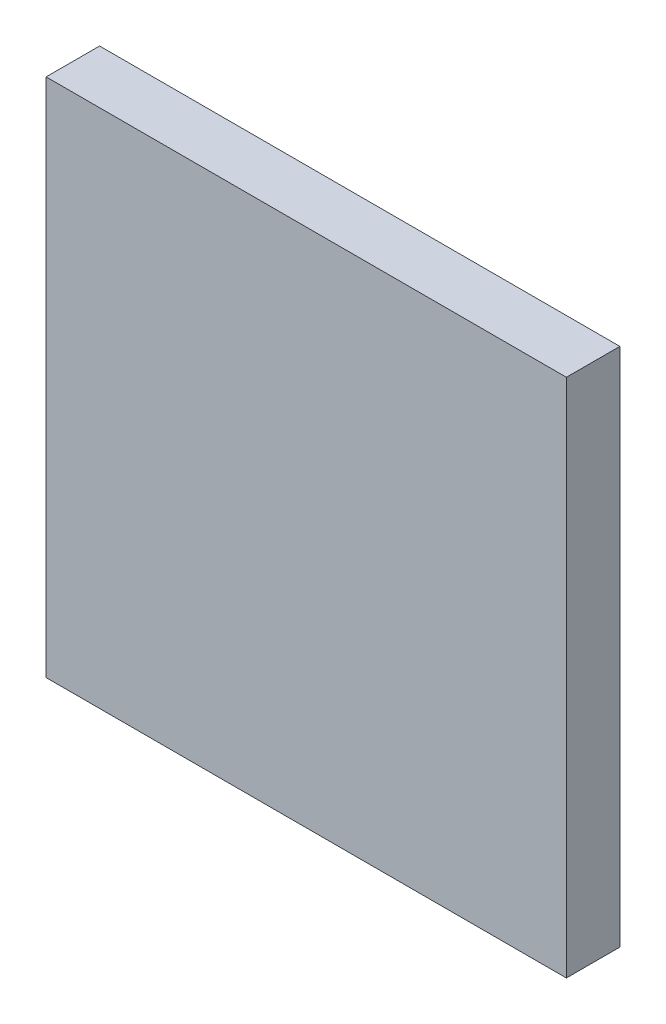
ISO-10303-21;
HEADER;
FILE_DESCRIPTION(('STEP AP214'),'2;1');
FILE_NAME('part.step','',(''),(''),'','','');
FILE_SCHEMA(('AUTOMOTIVE_DESIGN { 1 0 10303 214 1 1 1 1 }'));
ENDSEC;
DATA;
#1=APPLICATION_CONTEXT('core data for automotive mechanical design processes');
#2=APPLICATION_PROTOCOL_DEFINITION('international standard','automotive_design',2000,#1);
#3=PRODUCT_CONTEXT('',#1,'mechanical');
#4=PRODUCT('Part','Part','',(#3));
#5=PRODUCT_RELATED_PRODUCT_CATEGORY('part','',(#4));
#6=PRODUCT_DEFINITION_FORMATION('','',#4);
#7=PRODUCT_DEFINITION_CONTEXT('part definition',#1,'design');
#8=PRODUCT_DEFINITION('design','',#6,#7);
#9=PRODUCT_DEFINITION_SHAPE('','',#8);
#10=(LENGTH_UNIT() NAMED_UNIT(*) SI_UNIT(.MILLI.,.METRE.));
#11=(NAMED_UNIT(*) PLANE_ANGLE_UNIT() SI_UNIT($,.RADIAN.));
#12=(NAMED_UNIT(*) SI_UNIT($,.STERADIAN.) SOLID_ANGLE_UNIT());
#13=UNCERTAINTY_MEASURE_WITH_UNIT(LENGTH_MEASURE(1.E-05),#10,'distance_accuracy_value','');
#14=(GEOMETRIC_REPRESENTATION_CONTEXT(3) GLOBAL_UNCERTAINTY_ASSIGNED_CONTEXT((#13)) GLOBAL_UNIT_ASSIGNED_CONTEXT((#10,
#11,#12)) REPRESENTATION_CONTEXT('',''));
#15=CARTESIAN_POINT('',(0.,0.,0.));
#16=DIRECTION('',(0.,0.,1.));
#17=DIRECTION('',(1.,0.,0.));
#18=AXIS2_PLACEMENT_3D('',#15,#16,#17);
#19=CARTESIAN_POINT('',(-4.8645,-4.8645,1.));
#20=DIRECTION('',(1.,0.,0.));
#21=DIRECTION('',(0.,0.,-1.));
#22=AXIS2_PLACEMENT_3D('',#19,#20,#21);
#23=PLANE('',#22);
#24=DIRECTION('',(0.,-1.,0.));
#25=VECTOR('',#24,1.);
#26=CARTESIAN_POINT('',(-4.8645,-4.8645,0.));
#27=LINE('',#26,#25);
#28=CARTESIAN_POINT('',(-4.8645,4.8645,0.));
#29=VERTEX_POINT('',#28);
#30=CARTESIAN_POINT('',(-4.8645,-4.8645,0.));
#31=VERTEX_POINT('',#30);
#32=EDGE_CURVE('E95',#29,#31,#27,.T.);
#33=ORIENTED_EDGE('',*,*,#32,.T.);
#34=DIRECTION('',(0.,0.,-1.));
#35=VECTOR('',#34,1.);
#36=CARTESIAN_POINT('',(-4.8645,-4.8645,1.));
#37=LINE('',#36,#35);
#38=CARTESIAN_POINT('',(-4.8645,-4.8645,1.));
#39=VERTEX_POINT('',#38);
#40=EDGE_CURVE('E11',#39,#31,#37,.T.);
#41=ORIENTED_EDGE('',*,*,#40,.F.);
#42=DIRECTION('',(0.,-1.,0.));
#43=VECTOR('',#42,1.);
#44=CARTESIAN_POINT('',(-4.8645,-4.8645,1.));
#45=LINE('',#44,#43);
#46=CARTESIAN_POINT('',(-4.8645,4.8645,1.));
#47=VERTEX_POINT('',#46);
#48=EDGE_CURVE('E83',#47,#39,#45,.T.);
#49=ORIENTED_EDGE('',*,*,#48,.F.);
#50=DIRECTION('',(0.,0.,-1.));
#51=VECTOR('',#50,1.);
#52=CARTESIAN_POINT('',(-4.8645,4.8645,1.));
#53=LINE('',#52,#51);
#54=EDGE_CURVE('E91',#47,#29,#53,.T.);
#55=ORIENTED_EDGE('',*,*,#54,.T.);
#56=EDGE_LOOP('',(#33,#41,#49,#55));
#57=FACE_BOUND('',#56,.T.);
#58=ADVANCED_FACE('F32',(#57),#23,.F.);
#59=CARTESIAN_POINT('',(4.8645,-4.8645,1.));
#60=DIRECTION('',(0.,1.,0.));
#61=DIRECTION('',(0.,0.,1.));
#62=AXIS2_PLACEMENT_3D('',#59,#60,#61);
#63=PLANE('',#62);
#64=DIRECTION('',(1.,0.,0.));
#65=VECTOR('',#64,1.);
#66=CARTESIAN_POINT('',(4.8645,-4.8645,0.));
#67=LINE('',#66,#65);
#68=CARTESIAN_POINT('',(4.8645,-4.8645,0.));
#69=VERTEX_POINT('',#68);
#70=EDGE_CURVE('E87',#31,#69,#67,.T.);
#71=ORIENTED_EDGE('',*,*,#70,.T.);
#72=DIRECTION('',(0.,0.,-1.));
#73=VECTOR('',#72,1.);
#74=CARTESIAN_POINT('',(4.8645,-4.8645,1.));
#75=LINE('',#74,#73);
#76=CARTESIAN_POINT('',(4.8645,-4.8645,1.));
#77=VERTEX_POINT('',#76);
#78=EDGE_CURVE('E40',#77,#69,#75,.T.);
#79=ORIENTED_EDGE('',*,*,#78,.F.);
#80=DIRECTION('',(1.,0.,0.));
#81=VECTOR('',#80,1.);
#82=CARTESIAN_POINT('',(4.8645,-4.8645,1.));
#83=LINE('',#82,#81);
#84=EDGE_CURVE('E78',#39,#77,#83,.T.);
#85=ORIENTED_EDGE('',*,*,#84,.F.);
#86=ORIENTED_EDGE('',*,*,#40,.T.);
#87=EDGE_LOOP('',(#71,#79,#85,#86));
#88=FACE_BOUND('',#87,.T.);
#89=ADVANCED_FACE('F86',(#88),#63,.F.);
#90=CARTESIAN_POINT('',(4.8645,4.8645,1.));
#91=DIRECTION('',(-1.,0.,0.));
#92=DIRECTION('',(0.,0.,1.));
#93=AXIS2_PLACEMENT_3D('',#90,#91,#92);
#94=PLANE('',#93);
#95=DIRECTION('',(0.,1.,0.));
#96=VECTOR('',#95,1.);
#97=CARTESIAN_POINT('',(4.8645,4.8645,0.));
#98=LINE('',#97,#96);
#99=CARTESIAN_POINT('',(4.8645,4.8645,0.));
#100=VERTEX_POINT('',#99);
#101=EDGE_CURVE('E65',#69,#100,#98,.T.);
#102=ORIENTED_EDGE('',*,*,#101,.T.);
#103=DIRECTION('',(0.,0.,-1.));
#104=VECTOR('',#103,1.);
#105=CARTESIAN_POINT('',(4.8645,4.8645,1.));
#106=LINE('',#105,#104);
#107=CARTESIAN_POINT('',(4.8645,4.8645,1.));
#108=VERTEX_POINT('',#107);
#109=EDGE_CURVE('E88',#108,#100,#106,.T.);
#110=ORIENTED_EDGE('',*,*,#109,.F.);
#111=DIRECTION('',(0.,1.,0.));
#112=VECTOR('',#111,1.);
#113=CARTESIAN_POINT('',(4.8645,4.8645,1.));
#114=LINE('',#113,#112);
#115=EDGE_CURVE('E81',#77,#108,#114,.T.);
#116=ORIENTED_EDGE('',*,*,#115,.F.);
#117=ORIENTED_EDGE('',*,*,#78,.T.);
#118=EDGE_LOOP('',(#102,#110,#116,#117));
#119=FACE_BOUND('',#118,.T.);
#120=ADVANCED_FACE('F89',(#119),#94,.F.);
#121=CARTESIAN_POINT('',(-4.8645,4.8645,1.));
#122=DIRECTION('',(0.,-1.,0.));
#123=DIRECTION('',(0.,0.,-1.));
#124=AXIS2_PLACEMENT_3D('',#121,#122,#123);
#125=PLANE('',#124);
#126=DIRECTION('',(-1.,0.,0.));
#127=VECTOR('',#126,1.);
#128=CARTESIAN_POINT('',(-4.8645,4.8645,0.));
#129=LINE('',#128,#127);
#130=EDGE_CURVE('E71',#100,#29,#129,.T.);
#131=ORIENTED_EDGE('',*,*,#130,.T.);
#132=ORIENTED_EDGE('',*,*,#54,.F.);
#133=DIRECTION('',(-1.,0.,0.));
#134=VECTOR('',#133,1.);
#135=CARTESIAN_POINT('',(-4.8645,4.8645,1.));
#136=LINE('',#135,#134);
#137=EDGE_CURVE('E48',#108,#47,#136,.T.);
#138=ORIENTED_EDGE('',*,*,#137,.F.);
#139=ORIENTED_EDGE('',*,*,#109,.T.);
#140=EDGE_LOOP('',(#131,#132,#138,#139));
#141=FACE_BOUND('',#140,.T.);
#142=ADVANCED_FACE('F102',(#141),#125,.F.);
#143=CARTESIAN_POINT('',(0.,0.,1.));
#144=DIRECTION('',(0.,0.,-1.));
#145=DIRECTION('',(-1.,0.,0.));
#146=AXIS2_PLACEMENT_3D('',#143,#144,#145);
#147=PLANE('',#146);
#148=ORIENTED_EDGE('',*,*,#48,.T.);
#149=ORIENTED_EDGE('',*,*,#84,.T.);
#150=ORIENTED_EDGE('',*,*,#115,.T.);
#151=ORIENTED_EDGE('',*,*,#137,.T.);
#152=EDGE_LOOP('',(#148,#149,#150,#151));
#153=FACE_BOUND('',#152,.T.);
#154=ADVANCED_FACE('F79',(#153),#147,.F.);
#155=CARTESIAN_POINT('',(0.,0.,0.));
#156=DIRECTION('',(0.,0.,-1.));
#157=DIRECTION('',(-1.,0.,0.));
#158=AXIS2_PLACEMENT_3D('',#155,#156,#157);
#159=PLANE('',#158);
#160=ORIENTED_EDGE('',*,*,#32,.F.);
#161=ORIENTED_EDGE('',*,*,#130,.F.);
#162=ORIENTED_EDGE('',*,*,#101,.F.);
#163=ORIENTED_EDGE('',*,*,#70,.F.);
#164=EDGE_LOOP('',(#160,#161,#162,#163));
#165=FACE_BOUND('',#164,.T.);
#166=ADVANCED_FACE('F105',(#165),#159,.T.);
#167=CLOSED_SHELL('',(#58,#89,#120,#142,#154,#166));
#168=MANIFOLD_SOLID_BREP('B2',#167);
#169=ADVANCED_BREP_SHAPE_REPRESENTATION('',(#18,#168),#14);
#170=SHAPE_DEFINITION_REPRESENTATION(#9,#169);
ENDSEC;
END-ISO-10303-21;
